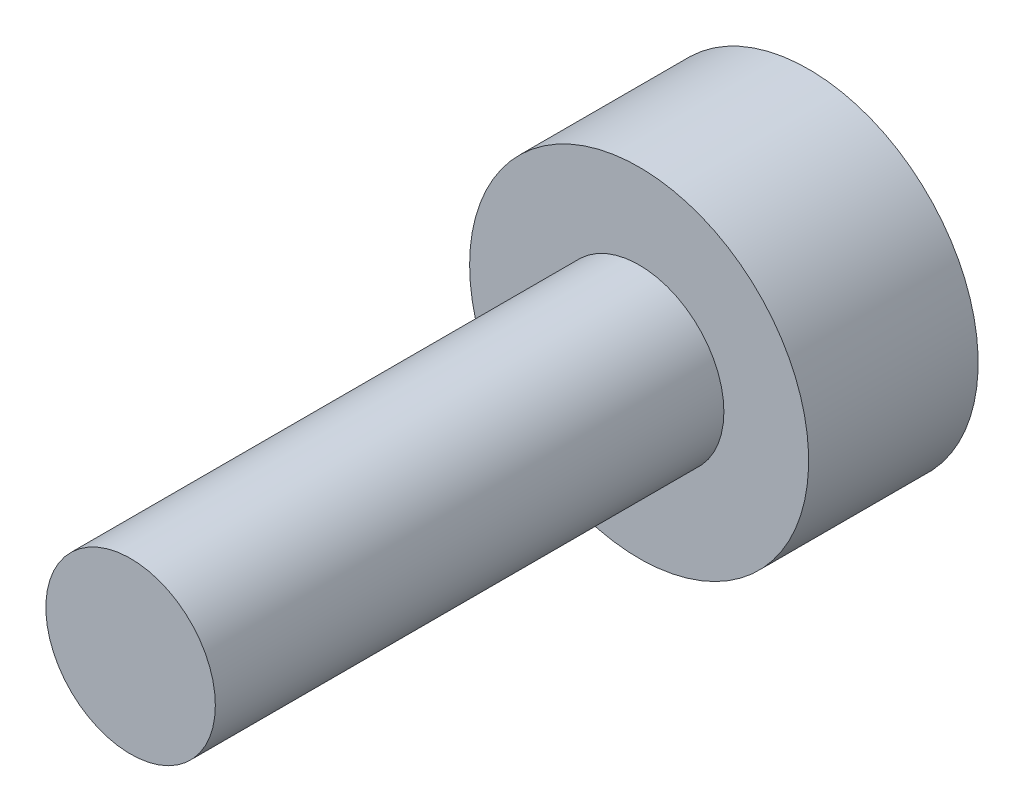
ISO-10303-21;
HEADER;
FILE_DESCRIPTION(('STEP AP214'),'2;1');
FILE_NAME('part.step','',(''),(''),'','','');
FILE_SCHEMA(('AUTOMOTIVE_DESIGN { 1 0 10303 214 1 1 1 1 }'));
ENDSEC;
DATA;
#1=APPLICATION_CONTEXT('core data for automotive mechanical design processes');
#2=APPLICATION_PROTOCOL_DEFINITION('international standard','automotive_design',2000,#1);
#3=PRODUCT_CONTEXT('',#1,'mechanical');
#4=PRODUCT('Part','Part','',(#3));
#5=PRODUCT_RELATED_PRODUCT_CATEGORY('part','',(#4));
#6=PRODUCT_DEFINITION_FORMATION('','',#4);
#7=PRODUCT_DEFINITION_CONTEXT('part definition',#1,'design');
#8=PRODUCT_DEFINITION('design','',#6,#7);
#9=PRODUCT_DEFINITION_SHAPE('','',#8);
#10=(LENGTH_UNIT() NAMED_UNIT(*) SI_UNIT(.MILLI.,.METRE.));
#11=(NAMED_UNIT(*) PLANE_ANGLE_UNIT() SI_UNIT($,.RADIAN.));
#12=(NAMED_UNIT(*) SI_UNIT($,.STERADIAN.) SOLID_ANGLE_UNIT());
#13=UNCERTAINTY_MEASURE_WITH_UNIT(LENGTH_MEASURE(1.E-05),#10,'distance_accuracy_value','');
#14=(GEOMETRIC_REPRESENTATION_CONTEXT(3) GLOBAL_UNCERTAINTY_ASSIGNED_CONTEXT((#13)) GLOBAL_UNIT_ASSIGNED_CONTEXT((#10,
#11,#12)) REPRESENTATION_CONTEXT('',''));
#15=CARTESIAN_POINT('',(0.,0.,0.));
#16=DIRECTION('',(0.,0.,1.));
#17=DIRECTION('',(1.,0.,0.));
#18=AXIS2_PLACEMENT_3D('',#15,#16,#17);
#19=CARTESIAN_POINT('',(0.,0.,6.));
#20=DIRECTION('',(0.,0.,-1.));
#21=DIRECTION('',(-1.,0.,0.));
#22=AXIS2_PLACEMENT_3D('',#19,#20,#21);
#23=CYLINDRICAL_SURFACE('',#22,1.);
#24=CARTESIAN_POINT('',(0.,0.,6.));
#25=DIRECTION('',(0.,0.,1.));
#26=DIRECTION('',(1.,0.,0.));
#27=AXIS2_PLACEMENT_3D('',#24,#25,#26);
#28=CIRCLE('',#27,1.);
#29=CARTESIAN_POINT('',(1.,0.,6.));
#30=VERTEX_POINT('',#29);
#31=EDGE_CURVE('E11',#30,#30,#28,.T.);
#32=ORIENTED_EDGE('',*,*,#31,.F.);
#33=EDGE_LOOP('',(#32));
#34=FACE_BOUND('',#33,.T.);
#35=CARTESIAN_POINT('',(0.,0.,0.));
#36=DIRECTION('',(0.,0.,1.));
#37=DIRECTION('',(1.,0.,0.));
#38=AXIS2_PLACEMENT_3D('',#35,#36,#37);
#39=CIRCLE('',#38,1.);
#40=CARTESIAN_POINT('',(1.,0.,0.));
#41=VERTEX_POINT('',#40);
#42=EDGE_CURVE('E35',#41,#41,#39,.T.);
#43=ORIENTED_EDGE('',*,*,#42,.T.);
#44=EDGE_LOOP('',(#43));
#45=FACE_BOUND('',#44,.T.);
#46=ADVANCED_FACE('F32',(#34,#45),#23,.T.);
#47=CARTESIAN_POINT('',(0.,0.,6.));
#48=DIRECTION('',(0.,0.,1.));
#49=DIRECTION('',(1.,0.,0.));
#50=AXIS2_PLACEMENT_3D('',#47,#48,#49);
#51=PLANE('',#50);
#52=ORIENTED_EDGE('',*,*,#31,.T.);
#53=EDGE_LOOP('',(#52));
#54=FACE_BOUND('',#53,.T.);
#55=ADVANCED_FACE('F164',(#54),#51,.T.);
#56=CARTESIAN_POINT('',(0.,0.,-2.));
#57=DIRECTION('',(0.,0.,1.));
#58=DIRECTION('',(1.,0.,0.));
#59=AXIS2_PLACEMENT_3D('',#56,#57,#58);
#60=CYLINDRICAL_SURFACE('',#59,2.);
#61=CARTESIAN_POINT('',(0.,0.,-2.));
#62=DIRECTION('',(0.,0.,-1.));
#63=DIRECTION('',(-1.,0.,0.));
#64=AXIS2_PLACEMENT_3D('',#61,#62,#63);
#65=CIRCLE('',#64,2.);
#66=CARTESIAN_POINT('',(-2.,0.,-2.));
#67=VERTEX_POINT('',#66);
#68=EDGE_CURVE('E139',#67,#67,#65,.T.);
#69=ORIENTED_EDGE('',*,*,#68,.F.);
#70=EDGE_LOOP('',(#69));
#71=FACE_BOUND('',#70,.T.);
#72=CARTESIAN_POINT('',(0.,0.,0.));
#73=DIRECTION('',(0.,0.,-1.));
#74=DIRECTION('',(-1.,0.,0.));
#75=AXIS2_PLACEMENT_3D('',#72,#73,#74);
#76=CIRCLE('',#75,2.);
#77=CARTESIAN_POINT('',(-2.,0.,0.));
#78=VERTEX_POINT('',#77);
#79=EDGE_CURVE('E133',#78,#78,#76,.T.);
#80=ORIENTED_EDGE('',*,*,#79,.T.);
#81=EDGE_LOOP('',(#80));
#82=FACE_BOUND('',#81,.T.);
#83=ADVANCED_FACE('F145',(#71,#82),#60,.T.);
#84=CARTESIAN_POINT('',(0.,0.,-2.));
#85=DIRECTION('',(0.,0.,-1.));
#86=DIRECTION('',(-1.,0.,0.));
#87=AXIS2_PLACEMENT_3D('',#84,#85,#86);
#88=PLANE('',#87);
#89=DIRECTION('',(-0.5,0.866025403784439,0.));
#90=VECTOR('',#89,1.);
#91=CARTESIAN_POINT('',(-0.5,-0.866025403784439,-2.));
#92=LINE('',#91,#90);
#93=CARTESIAN_POINT('',(-0.5,-0.866025403784439,-2.));
#94=VERTEX_POINT('',#93);
#95=CARTESIAN_POINT('',(-1.,0.,-2.));
#96=VERTEX_POINT('',#95);
#97=EDGE_CURVE('E46',#94,#96,#92,.T.);
#98=ORIENTED_EDGE('',*,*,#97,.F.);
#99=DIRECTION('',(-1.,0.,0.));
#100=VECTOR('',#99,1.);
#101=CARTESIAN_POINT('',(0.5,-0.866025403784439,-2.));
#102=LINE('',#101,#100);
#103=CARTESIAN_POINT('',(0.5,-0.866025403784439,-2.));
#104=VERTEX_POINT('',#103);
#105=EDGE_CURVE('E129',#104,#94,#102,.T.);
#106=ORIENTED_EDGE('',*,*,#105,.F.);
#107=DIRECTION('',(-0.5,-0.866025403784439,0.));
#108=VECTOR('',#107,1.);
#109=CARTESIAN_POINT('',(1.,0.,-2.));
#110=LINE('',#109,#108);
#111=CARTESIAN_POINT('',(1.,0.,-2.));
#112=VERTEX_POINT('',#111);
#113=EDGE_CURVE('E127',#112,#104,#110,.T.);
#114=ORIENTED_EDGE('',*,*,#113,.F.);
#115=DIRECTION('',(0.5,-0.866025403784439,0.));
#116=VECTOR('',#115,1.);
#117=CARTESIAN_POINT('',(0.5,0.866025403784439,-2.));
#118=LINE('',#117,#116);
#119=CARTESIAN_POINT('',(0.5,0.866025403784439,-2.));
#120=VERTEX_POINT('',#119);
#121=EDGE_CURVE('E94',#120,#112,#118,.T.);
#122=ORIENTED_EDGE('',*,*,#121,.F.);
#123=DIRECTION('',(1.,0.,0.));
#124=VECTOR('',#123,1.);
#125=CARTESIAN_POINT('',(-0.5,0.866025403784439,-2.));
#126=LINE('',#125,#124);
#127=CARTESIAN_POINT('',(-0.5,0.866025403784439,-2.));
#128=VERTEX_POINT('',#127);
#129=EDGE_CURVE('E123',#128,#120,#126,.T.);
#130=ORIENTED_EDGE('',*,*,#129,.F.);
#131=DIRECTION('',(0.5,0.866025403784439,0.));
#132=VECTOR('',#131,1.);
#133=CARTESIAN_POINT('',(-1.,0.,-2.));
#134=LINE('',#133,#132);
#135=EDGE_CURVE('E120',#96,#128,#134,.T.);
#136=ORIENTED_EDGE('',*,*,#135,.F.);
#137=EDGE_LOOP('',(#98,#106,#114,#122,#130,#136));
#138=FACE_BOUND('',#137,.T.);
#139=ORIENTED_EDGE('',*,*,#68,.T.);
#140=EDGE_LOOP('',(#139));
#141=FACE_BOUND('',#140,.T.);
#142=ADVANCED_FACE('F150',(#138,#141),#88,.T.);
#143=CARTESIAN_POINT('',(0.,0.,0.));
#144=DIRECTION('',(0.,0.,-1.));
#145=DIRECTION('',(-1.,0.,0.));
#146=AXIS2_PLACEMENT_3D('',#143,#144,#145);
#147=PLANE('',#146);
#148=ORIENTED_EDGE('',*,*,#42,.F.);
#149=EDGE_LOOP('',(#148));
#150=FACE_BOUND('',#149,.T.);
#151=ORIENTED_EDGE('',*,*,#79,.F.);
#152=EDGE_LOOP('',(#151));
#153=FACE_BOUND('',#152,.T.);
#154=ADVANCED_FACE('F147',(#150,#153),#147,.F.);
#155=CARTESIAN_POINT('',(-0.5,-0.866025403784439,-1.));
#156=DIRECTION('',(-0.866025403784439,-0.5,0.));
#157=DIRECTION('',(0.5,-0.866025403784439,0.));
#158=AXIS2_PLACEMENT_3D('',#155,#156,#157);
#159=PLANE('',#158);
#160=ORIENTED_EDGE('',*,*,#97,.T.);
#161=DIRECTION('',(0.,0.,-1.));
#162=VECTOR('',#161,1.);
#163=CARTESIAN_POINT('',(-1.,0.,-1.));
#164=LINE('',#163,#162);
#165=CARTESIAN_POINT('',(-1.,0.,-1.));
#166=VERTEX_POINT('',#165);
#167=EDGE_CURVE('E76',#166,#96,#164,.T.);
#168=ORIENTED_EDGE('',*,*,#167,.F.);
#169=DIRECTION('',(-0.5,0.866025403784439,0.));
#170=VECTOR('',#169,1.);
#171=CARTESIAN_POINT('',(-0.5,-0.866025403784439,-1.));
#172=LINE('',#171,#170);
#173=CARTESIAN_POINT('',(-0.5,-0.866025403784439,-1.));
#174=VERTEX_POINT('',#173);
#175=EDGE_CURVE('E131',#174,#166,#172,.T.);
#176=ORIENTED_EDGE('',*,*,#175,.F.);
#177=DIRECTION('',(0.,0.,-1.));
#178=VECTOR('',#177,1.);
#179=CARTESIAN_POINT('',(-0.5,-0.866025403784439,-1.));
#180=LINE('',#179,#178);
#181=EDGE_CURVE('E54',#174,#94,#180,.T.);
#182=ORIENTED_EDGE('',*,*,#181,.T.);
#183=EDGE_LOOP('',(#160,#168,#176,#182));
#184=FACE_BOUND('',#183,.T.);
#185=ADVANCED_FACE('F149',(#184),#159,.F.);
#186=CARTESIAN_POINT('',(0.5,-0.866025403784439,-1.));
#187=DIRECTION('',(0.,-1.,0.));
#188=DIRECTION('',(0.,0.,-1.));
#189=AXIS2_PLACEMENT_3D('',#186,#187,#188);
#190=PLANE('',#189);
#191=ORIENTED_EDGE('',*,*,#105,.T.);
#192=ORIENTED_EDGE('',*,*,#181,.F.);
#193=DIRECTION('',(-1.,0.,0.));
#194=VECTOR('',#193,1.);
#195=CARTESIAN_POINT('',(0.5,-0.866025403784439,-1.));
#196=LINE('',#195,#194);
#197=CARTESIAN_POINT('',(0.5,-0.866025403784439,-1.));
#198=VERTEX_POINT('',#197);
#199=EDGE_CURVE('E106',#198,#174,#196,.T.);
#200=ORIENTED_EDGE('',*,*,#199,.F.);
#201=DIRECTION('',(0.,0.,-1.));
#202=VECTOR('',#201,1.);
#203=CARTESIAN_POINT('',(0.5,-0.866025403784439,-1.));
#204=LINE('',#203,#202);
#205=EDGE_CURVE('E98',#198,#104,#204,.T.);
#206=ORIENTED_EDGE('',*,*,#205,.T.);
#207=EDGE_LOOP('',(#191,#192,#200,#206));
#208=FACE_BOUND('',#207,.T.);
#209=ADVANCED_FACE('F157',(#208),#190,.F.);
#210=CARTESIAN_POINT('',(1.,0.,-1.));
#211=DIRECTION('',(0.866025403784439,-0.5,0.));
#212=DIRECTION('',(0.5,0.866025403784439,0.));
#213=AXIS2_PLACEMENT_3D('',#210,#211,#212);
#214=PLANE('',#213);
#215=ORIENTED_EDGE('',*,*,#113,.T.);
#216=ORIENTED_EDGE('',*,*,#205,.F.);
#217=DIRECTION('',(-0.5,-0.866025403784439,0.));
#218=VECTOR('',#217,1.);
#219=CARTESIAN_POINT('',(1.,0.,-1.));
#220=LINE('',#219,#218);
#221=CARTESIAN_POINT('',(1.,0.,-1.));
#222=VERTEX_POINT('',#221);
#223=EDGE_CURVE('E102',#222,#198,#220,.T.);
#224=ORIENTED_EDGE('',*,*,#223,.F.);
#225=DIRECTION('',(0.,0.,-1.));
#226=VECTOR('',#225,1.);
#227=CARTESIAN_POINT('',(1.,0.,-1.));
#228=LINE('',#227,#226);
#229=EDGE_CURVE('E87',#222,#112,#228,.T.);
#230=ORIENTED_EDGE('',*,*,#229,.T.);
#231=EDGE_LOOP('',(#215,#216,#224,#230));
#232=FACE_BOUND('',#231,.T.);
#233=ADVANCED_FACE('F103',(#232),#214,.F.);
#234=CARTESIAN_POINT('',(0.5,0.866025403784439,-1.));
#235=DIRECTION('',(0.866025403784439,0.5,0.));
#236=DIRECTION('',(-0.5,0.866025403784439,0.));
#237=AXIS2_PLACEMENT_3D('',#234,#235,#236);
#238=PLANE('',#237);
#239=ORIENTED_EDGE('',*,*,#121,.T.);
#240=ORIENTED_EDGE('',*,*,#229,.F.);
#241=DIRECTION('',(0.5,-0.866025403784439,0.));
#242=VECTOR('',#241,1.);
#243=CARTESIAN_POINT('',(0.5,0.866025403784439,-1.));
#244=LINE('',#243,#242);
#245=CARTESIAN_POINT('',(0.5,0.866025403784439,-1.));
#246=VERTEX_POINT('',#245);
#247=EDGE_CURVE('E91',#246,#222,#244,.T.);
#248=ORIENTED_EDGE('',*,*,#247,.F.);
#249=DIRECTION('',(0.,0.,-1.));
#250=VECTOR('',#249,1.);
#251=CARTESIAN_POINT('',(0.5,0.866025403784439,-1.));
#252=LINE('',#251,#250);
#253=EDGE_CURVE('E99',#246,#120,#252,.T.);
#254=ORIENTED_EDGE('',*,*,#253,.T.);
#255=EDGE_LOOP('',(#239,#240,#248,#254));
#256=FACE_BOUND('',#255,.T.);
#257=ADVANCED_FACE('F89',(#256),#238,.F.);
#258=CARTESIAN_POINT('',(-0.5,0.866025403784439,-1.));
#259=DIRECTION('',(0.,1.,0.));
#260=DIRECTION('',(-1.,0.,0.));
#261=AXIS2_PLACEMENT_3D('',#258,#259,#260);
#262=PLANE('',#261);
#263=ORIENTED_EDGE('',*,*,#129,.T.);
#264=ORIENTED_EDGE('',*,*,#253,.F.);
#265=DIRECTION('',(1.,0.,0.));
#266=VECTOR('',#265,1.);
#267=CARTESIAN_POINT('',(-0.5,0.866025403784439,-1.));
#268=LINE('',#267,#266);
#269=CARTESIAN_POINT('',(-0.5,0.866025403784439,-1.));
#270=VERTEX_POINT('',#269);
#271=EDGE_CURVE('E112',#270,#246,#268,.T.);
#272=ORIENTED_EDGE('',*,*,#271,.F.);
#273=DIRECTION('',(0.,0.,-1.));
#274=VECTOR('',#273,1.);
#275=CARTESIAN_POINT('',(-0.5,0.866025403784439,-1.));
#276=LINE('',#275,#274);
#277=EDGE_CURVE('E136',#270,#128,#276,.T.);
#278=ORIENTED_EDGE('',*,*,#277,.T.);
#279=EDGE_LOOP('',(#263,#264,#272,#278));
#280=FACE_BOUND('',#279,.T.);
#281=ADVANCED_FACE('F218',(#280),#262,.F.);
#282=CARTESIAN_POINT('',(-1.,0.,-1.));
#283=DIRECTION('',(-0.866025403784439,0.5,0.));
#284=DIRECTION('',(-0.5,-0.866025403784439,0.));
#285=AXIS2_PLACEMENT_3D('',#282,#283,#284);
#286=PLANE('',#285);
#287=ORIENTED_EDGE('',*,*,#135,.T.);
#288=ORIENTED_EDGE('',*,*,#277,.F.);
#289=DIRECTION('',(0.5,0.866025403784439,0.));
#290=VECTOR('',#289,1.);
#291=CARTESIAN_POINT('',(-1.,0.,-1.));
#292=LINE('',#291,#290);
#293=EDGE_CURVE('E114',#166,#270,#292,.T.);
#294=ORIENTED_EDGE('',*,*,#293,.F.);
#295=ORIENTED_EDGE('',*,*,#167,.T.);
#296=EDGE_LOOP('',(#287,#288,#294,#295));
#297=FACE_BOUND('',#296,.T.);
#298=ADVANCED_FACE('F227',(#297),#286,.F.);
#299=CARTESIAN_POINT('',(0.,0.,-1.));
#300=DIRECTION('',(0.,0.,-1.));
#301=DIRECTION('',(-1.,0.,0.));
#302=AXIS2_PLACEMENT_3D('',#299,#300,#301);
#303=PLANE('',#302);
#304=ORIENTED_EDGE('',*,*,#175,.T.);
#305=ORIENTED_EDGE('',*,*,#293,.T.);
#306=ORIENTED_EDGE('',*,*,#271,.T.);
#307=ORIENTED_EDGE('',*,*,#247,.T.);
#308=ORIENTED_EDGE('',*,*,#223,.T.);
#309=ORIENTED_EDGE('',*,*,#199,.T.);
#310=EDGE_LOOP('',(#304,#305,#306,#307,#308,#309));
#311=FACE_BOUND('',#310,.T.);
#312=ADVANCED_FACE('F109',(#311),#303,.T.);
#313=CLOSED_SHELL('',(#46,#55,#83,#142,#154,#185,#209,#233,#257,#281,#298,#312));
#314=MANIFOLD_SOLID_BREP('B2',#313);
#315=ADVANCED_BREP_SHAPE_REPRESENTATION('',(#18,#314),#14);
#316=SHAPE_DEFINITION_REPRESENTATION(#9,#315);
ENDSEC;
END-ISO-10303-21;
